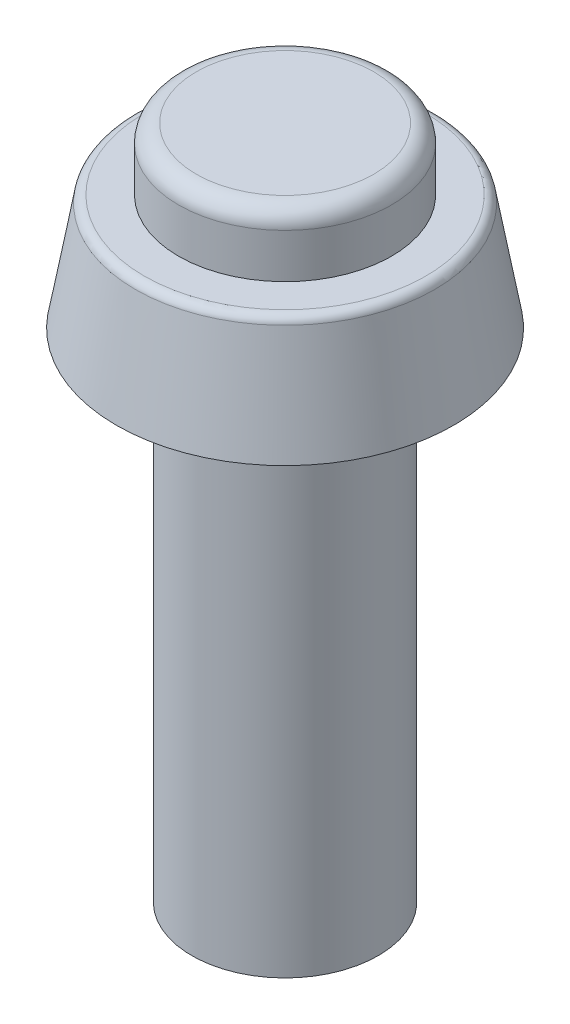
ISO-10303-21;
HEADER;
FILE_DESCRIPTION(('STEP AP214'),'2;1');
FILE_NAME('part.step','',(''),(''),'','','');
FILE_SCHEMA(('AUTOMOTIVE_DESIGN { 1 0 10303 214 1 1 1 1 }'));
ENDSEC;
DATA;
#1=APPLICATION_CONTEXT('core data for automotive mechanical design processes');
#2=APPLICATION_PROTOCOL_DEFINITION('international standard','automotive_design',2000,#1);
#3=PRODUCT_CONTEXT('',#1,'mechanical');
#4=PRODUCT('Part','Part','',(#3));
#5=PRODUCT_RELATED_PRODUCT_CATEGORY('part','',(#4));
#6=PRODUCT_DEFINITION_FORMATION('','',#4);
#7=PRODUCT_DEFINITION_CONTEXT('part definition',#1,'design');
#8=PRODUCT_DEFINITION('design','',#6,#7);
#9=PRODUCT_DEFINITION_SHAPE('','',#8);
#10=(LENGTH_UNIT() NAMED_UNIT(*) SI_UNIT(.MILLI.,.METRE.));
#11=(NAMED_UNIT(*) PLANE_ANGLE_UNIT() SI_UNIT($,.RADIAN.));
#12=(NAMED_UNIT(*) SI_UNIT($,.STERADIAN.) SOLID_ANGLE_UNIT());
#13=UNCERTAINTY_MEASURE_WITH_UNIT(LENGTH_MEASURE(1.E-05),#10,'distance_accuracy_value','');
#14=(GEOMETRIC_REPRESENTATION_CONTEXT(3) GLOBAL_UNCERTAINTY_ASSIGNED_CONTEXT((#13)) GLOBAL_UNIT_ASSIGNED_CONTEXT((#10,
#11,#12)) REPRESENTATION_CONTEXT('',''));
#15=CARTESIAN_POINT('',(0.,0.,0.));
#16=DIRECTION('',(0.,0.,1.));
#17=DIRECTION('',(1.,0.,0.));
#18=AXIS2_PLACEMENT_3D('',#15,#16,#17);
#19=CARTESIAN_POINT('',(0.,10.,0.));
#20=DIRECTION('',(0.,-1.,0.));
#21=DIRECTION('',(0.,0.,-1.));
#22=AXIS2_PLACEMENT_3D('',#19,#20,#21);
#23=CYLINDRICAL_SURFACE('',#22,6.);
#24=CARTESIAN_POINT('',(0.,9.,0.));
#25=DIRECTION('',(0.,1.,0.));
#26=DIRECTION('',(0.,0.,1.));
#27=AXIS2_PLACEMENT_3D('',#24,#25,#26);
#28=CIRCLE('',#27,6.);
#29=CARTESIAN_POINT('',(0.,9.,6.));
#30=VERTEX_POINT('',#29);
#31=EDGE_CURVE('E11',#30,#30,#28,.F.);
#32=ORIENTED_EDGE('',*,*,#31,.T.);
#33=EDGE_LOOP('',(#32));
#34=FACE_BOUND('',#33,.T.);
#35=CARTESIAN_POINT('',(0.,6.5,0.));
#36=DIRECTION('',(0.,1.,0.));
#37=DIRECTION('',(0.,0.,1.));
#38=AXIS2_PLACEMENT_3D('',#35,#36,#37);
#39=CIRCLE('',#38,6.);
#40=CARTESIAN_POINT('',(0.,6.5,6.));
#41=VERTEX_POINT('',#40);
#42=EDGE_CURVE('E54',#41,#41,#39,.T.);
#43=ORIENTED_EDGE('',*,*,#42,.T.);
#44=EDGE_LOOP('',(#43));
#45=FACE_BOUND('',#44,.T.);
#46=ADVANCED_FACE('F43',(#34,#45),#23,.T.);
#47=CARTESIAN_POINT('',(0.,10.,0.));
#48=DIRECTION('',(0.,1.,0.));
#49=DIRECTION('',(0.,0.,1.));
#50=AXIS2_PLACEMENT_3D('',#47,#48,#49);
#51=PLANE('',#50);
#52=CARTESIAN_POINT('',(0.,10.,0.));
#53=DIRECTION('',(0.,1.,0.));
#54=DIRECTION('',(0.,0.,1.));
#55=AXIS2_PLACEMENT_3D('',#52,#53,#54);
#56=CIRCLE('',#55,5.);
#57=CARTESIAN_POINT('',(0.,10.,5.));
#58=VERTEX_POINT('',#57);
#59=EDGE_CURVE('E50',#58,#58,#56,.T.);
#60=ORIENTED_EDGE('',*,*,#59,.T.);
#61=EDGE_LOOP('',(#60));
#62=FACE_BOUND('',#61,.T.);
#63=ADVANCED_FACE('F64',(#62),#51,.T.);
#64=CARTESIAN_POINT('',(0.,6.5,0.));
#65=DIRECTION('',(0.,1.,0.));
#66=DIRECTION('',(0.,0.,1.));
#67=AXIS2_PLACEMENT_3D('',#64,#65,#66);
#68=PLANE('',#67);
#69=ORIENTED_EDGE('',*,*,#42,.F.);
#70=EDGE_LOOP('',(#69));
#71=FACE_BOUND('',#70,.T.);
#72=ADVANCED_FACE('F62',(#71),#68,.F.);
#73=CARTESIAN_POINT('',(0.,9.,0.));
#74=DIRECTION('',(0.,1.,0.));
#75=DIRECTION('',(0.,0.,1.));
#76=AXIS2_PLACEMENT_3D('',#73,#74,#75);
#77=TOROIDAL_SURFACE('',#76,5.,1.);
#78=ORIENTED_EDGE('',*,*,#31,.F.);
#79=EDGE_LOOP('',(#78));
#80=FACE_BOUND('',#79,.T.);
#81=ORIENTED_EDGE('',*,*,#59,.F.);
#82=EDGE_LOOP('',(#81));
#83=FACE_BOUND('',#82,.T.);
#84=ADVANCED_FACE('F45',(#80,#83),#77,.T.);
#85=CLOSED_SHELL('',(#46,#63,#72,#84));
#86=MANIFOLD_SOLID_BREP('B2',#85);
#87=CARTESIAN_POINT('',(0.,0.,0.));
#88=DIRECTION('',(0.,-1.,0.));
#89=DIRECTION('',(0.,0.,1.));
#90=AXIS2_PLACEMENT_3D('',#87,#88,#89);
#91=CONICAL_SURFACE('',#90,9.5,0.174532925199433);
#92=CARTESIAN_POINT('',(0.,6.08682408883347,0.));
#93=DIRECTION('',(0.,-1.,0.));
#94=DIRECTION('',(0.,0.,-1.));
#95=AXIS2_PLACEMENT_3D('',#92,#93,#94);
#96=CIRCLE('',#95,8.42672868631244);
#97=CARTESIAN_POINT('',(0.,6.08682408883347,-8.42672868631244));
#98=VERTEX_POINT('',#97);
#99=EDGE_CURVE('E42',#98,#98,#96,.T.);
#100=ORIENTED_EDGE('',*,*,#99,.T.);
#101=EDGE_LOOP('',(#100));
#102=FACE_BOUND('',#101,.T.);
#103=CARTESIAN_POINT('',(0.,0.,0.));
#104=DIRECTION('',(0.,1.,0.));
#105=DIRECTION('',(0.,0.,1.));
#106=AXIS2_PLACEMENT_3D('',#103,#104,#105);
#107=CIRCLE('',#106,9.5);
#108=CARTESIAN_POINT('',(0.,0.,9.5));
#109=VERTEX_POINT('',#108);
#110=EDGE_CURVE('E114',#109,#109,#107,.T.);
#111=ORIENTED_EDGE('',*,*,#110,.T.);
#112=EDGE_LOOP('',(#111));
#113=FACE_BOUND('',#112,.T.);
#114=ADVANCED_FACE('F99',(#102,#113),#91,.T.);
#115=CARTESIAN_POINT('',(0.,6.5,0.));
#116=DIRECTION('',(0.,1.,0.));
#117=DIRECTION('',(0.,0.,1.));
#118=AXIS2_PLACEMENT_3D('',#115,#116,#117);
#119=PLANE('',#118);
#120=CARTESIAN_POINT('',(0.,6.5,0.));
#121=DIRECTION('',(0.,1.,0.));
#122=DIRECTION('',(0.,0.,1.));
#123=AXIS2_PLACEMENT_3D('',#120,#121,#122);
#124=CIRCLE('',#123,7.93432480980634);
#125=CARTESIAN_POINT('',(0.,6.5,7.93432480980634));
#126=VERTEX_POINT('',#125);
#127=EDGE_CURVE('E106',#126,#126,#124,.T.);
#128=ORIENTED_EDGE('',*,*,#127,.T.);
#129=EDGE_LOOP('',(#128));
#130=FACE_BOUND('',#129,.T.);
#131=ADVANCED_FACE('F134',(#130),#119,.T.);
#132=CARTESIAN_POINT('',(0.,0.,0.));
#133=DIRECTION('',(0.,1.,0.));
#134=DIRECTION('',(0.,0.,1.));
#135=AXIS2_PLACEMENT_3D('',#132,#133,#134);
#136=PLANE('',#135);
#137=CARTESIAN_POINT('',(0.,0.,0.));
#138=DIRECTION('',(0.,-1.,0.));
#139=DIRECTION('',(0.,0.,-1.));
#140=AXIS2_PLACEMENT_3D('',#137,#138,#139);
#141=CIRCLE('',#140,5.25);
#142=CARTESIAN_POINT('',(0.,0.,-5.25));
#143=VERTEX_POINT('',#142);
#144=EDGE_CURVE('E110',#143,#143,#141,.T.);
#145=ORIENTED_EDGE('',*,*,#144,.F.);
#146=EDGE_LOOP('',(#145));
#147=FACE_BOUND('',#146,.T.);
#148=ORIENTED_EDGE('',*,*,#110,.F.);
#149=EDGE_LOOP('',(#148));
#150=FACE_BOUND('',#149,.T.);
#151=ADVANCED_FACE('F128',(#147,#150),#136,.F.);
#152=CARTESIAN_POINT('',(0.,-28.,0.));
#153=DIRECTION('',(0.,1.,0.));
#154=DIRECTION('',(0.,0.,1.));
#155=AXIS2_PLACEMENT_3D('',#152,#153,#154);
#156=CYLINDRICAL_SURFACE('',#155,5.25);
#157=CARTESIAN_POINT('',(0.,-28.,0.));
#158=DIRECTION('',(0.,-1.,0.));
#159=DIRECTION('',(0.,0.,-1.));
#160=AXIS2_PLACEMENT_3D('',#157,#158,#159);
#161=CIRCLE('',#160,5.25);
#162=CARTESIAN_POINT('',(0.,-28.,-5.25));
#163=VERTEX_POINT('',#162);
#164=EDGE_CURVE('E118',#163,#163,#161,.T.);
#165=ORIENTED_EDGE('',*,*,#164,.F.);
#166=EDGE_LOOP('',(#165));
#167=FACE_BOUND('',#166,.T.);
#168=ORIENTED_EDGE('',*,*,#144,.T.);
#169=EDGE_LOOP('',(#168));
#170=FACE_BOUND('',#169,.T.);
#171=ADVANCED_FACE('F125',(#167,#170),#156,.T.);
#172=CARTESIAN_POINT('',(0.,-28.,0.));
#173=DIRECTION('',(0.,-1.,0.));
#174=DIRECTION('',(0.,0.,-1.));
#175=AXIS2_PLACEMENT_3D('',#172,#173,#174);
#176=PLANE('',#175);
#177=ORIENTED_EDGE('',*,*,#164,.T.);
#178=EDGE_LOOP('',(#177));
#179=FACE_BOUND('',#178,.T.);
#180=ADVANCED_FACE('F123',(#179),#176,.T.);
#181=CARTESIAN_POINT('',(0.,6.,0.));
#182=DIRECTION('',(0.,1.,0.));
#183=DIRECTION('',(0.,0.,1.));
#184=AXIS2_PLACEMENT_3D('',#181,#182,#183);
#185=TOROIDAL_SURFACE('',#184,7.93432480980634,0.5);
#186=ORIENTED_EDGE('',*,*,#99,.F.);
#187=EDGE_LOOP('',(#186));
#188=FACE_BOUND('',#187,.T.);
#189=ORIENTED_EDGE('',*,*,#127,.F.);
#190=EDGE_LOOP('',(#189));
#191=FACE_BOUND('',#190,.T.);
#192=ADVANCED_FACE('F101',(#188,#191),#185,.T.);
#193=CLOSED_SHELL('',(#114,#131,#151,#171,#180,#192));
#194=MANIFOLD_SOLID_BREP('B6',#193);
#195=ADVANCED_BREP_SHAPE_REPRESENTATION('',(#18,#86,#194),#14);
#196=SHAPE_DEFINITION_REPRESENTATION(#9,#195);
ENDSEC;
END-ISO-10303-21;
